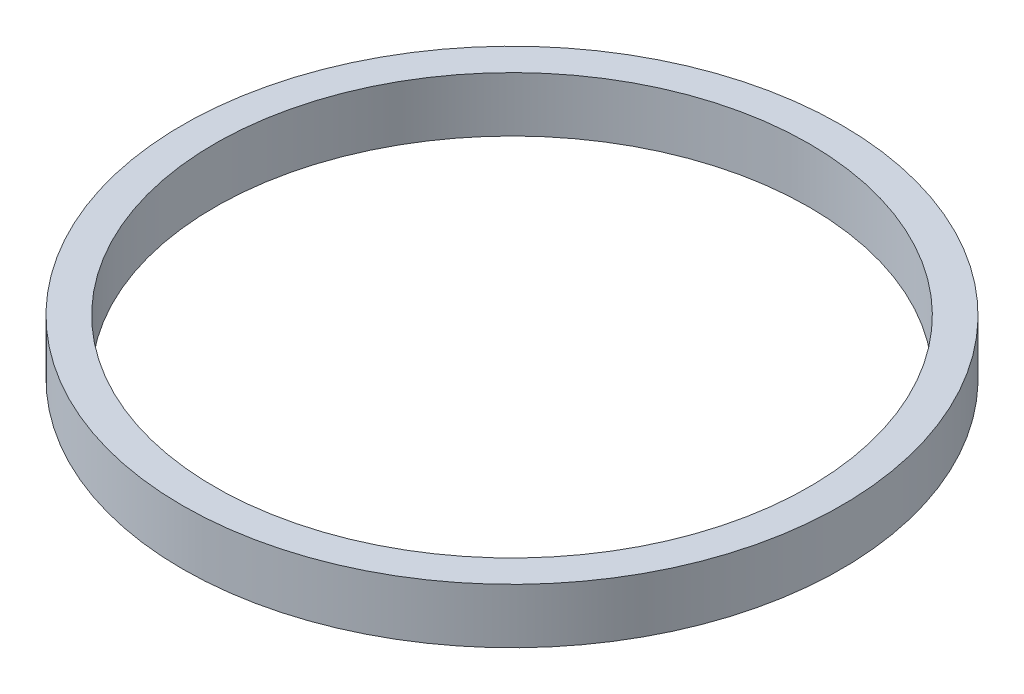
ISO-10303-21;
HEADER;
FILE_DESCRIPTION(('STEP AP214'),'2;1');
FILE_NAME('part.step','',(''),(''),'','','');
FILE_SCHEMA(('AUTOMOTIVE_DESIGN { 1 0 10303 214 1 1 1 1 }'));
ENDSEC;
DATA;
#1=APPLICATION_CONTEXT('core data for automotive mechanical design processes');
#2=APPLICATION_PROTOCOL_DEFINITION('international standard','automotive_design',2000,#1);
#3=PRODUCT_CONTEXT('',#1,'mechanical');
#4=PRODUCT('Part','Part','',(#3));
#5=PRODUCT_RELATED_PRODUCT_CATEGORY('part','',(#4));
#6=PRODUCT_DEFINITION_FORMATION('','',#4);
#7=PRODUCT_DEFINITION_CONTEXT('part definition',#1,'design');
#8=PRODUCT_DEFINITION('design','',#6,#7);
#9=PRODUCT_DEFINITION_SHAPE('','',#8);
#10=(LENGTH_UNIT() NAMED_UNIT(*) SI_UNIT(.MILLI.,.METRE.));
#11=(NAMED_UNIT(*) PLANE_ANGLE_UNIT() SI_UNIT($,.RADIAN.));
#12=(NAMED_UNIT(*) SI_UNIT($,.STERADIAN.) SOLID_ANGLE_UNIT());
#13=UNCERTAINTY_MEASURE_WITH_UNIT(LENGTH_MEASURE(1.E-05),#10,'distance_accuracy_value','');
#14=(GEOMETRIC_REPRESENTATION_CONTEXT(3) GLOBAL_UNCERTAINTY_ASSIGNED_CONTEXT((#13)) GLOBAL_UNIT_ASSIGNED_CONTEXT((#10,
#11,#12)) REPRESENTATION_CONTEXT('',''));
#15=CARTESIAN_POINT('',(0.,0.,0.));
#16=DIRECTION('',(0.,0.,1.));
#17=DIRECTION('',(1.,0.,0.));
#18=AXIS2_PLACEMENT_3D('',#15,#16,#17);
#19=CARTESIAN_POINT('',(0.,2.35,0.));
#20=DIRECTION('',(0.,-1.,0.));
#21=DIRECTION('',(0.,0.,-1.));
#22=AXIS2_PLACEMENT_3D('',#19,#20,#21);
#23=PLANE('',#22);
#24=CARTESIAN_POINT('',(0.,2.35,0.));
#25=DIRECTION('',(0.,1.,0.));
#26=DIRECTION('',(0.,0.,1.));
#27=AXIS2_PLACEMENT_3D('',#24,#25,#26);
#28=CIRCLE('',#27,4.6);
#29=CARTESIAN_POINT('',(0.,2.35,-4.6));
#30=VERTEX_POINT('',#29);
#31=EDGE_CURVE('E11',#30,#30,#28,.T.);
#32=ORIENTED_EDGE('',*,*,#31,.F.);
#33=EDGE_LOOP('',(#32));
#34=FACE_BOUND('',#33,.T.);
#35=CARTESIAN_POINT('',(0.,2.35,0.));
#36=DIRECTION('',(0.,-1.,0.));
#37=DIRECTION('',(0.,0.,-1.));
#38=AXIS2_PLACEMENT_3D('',#35,#36,#37);
#39=CIRCLE('',#38,5.1);
#40=CARTESIAN_POINT('',(0.,2.35,5.1));
#41=VERTEX_POINT('',#40);
#42=EDGE_CURVE('E54',#41,#41,#39,.T.);
#43=ORIENTED_EDGE('',*,*,#42,.F.);
#44=EDGE_LOOP('',(#43));
#45=FACE_BOUND('',#44,.T.);
#46=ADVANCED_FACE('F16',(#34,#45),#23,.F.);
#47=CARTESIAN_POINT('',(0.,1.5,0.));
#48=DIRECTION('',(0.,-1.,0.));
#49=DIRECTION('',(0.,0.,-1.));
#50=AXIS2_PLACEMENT_3D('',#47,#48,#49);
#51=PLANE('',#50);
#52=CARTESIAN_POINT('',(0.,1.5,0.));
#53=DIRECTION('',(0.,1.,0.));
#54=DIRECTION('',(0.,0.,1.));
#55=AXIS2_PLACEMENT_3D('',#52,#53,#54);
#56=CIRCLE('',#55,4.6);
#57=CARTESIAN_POINT('',(0.,1.5,-4.6));
#58=VERTEX_POINT('',#57);
#59=EDGE_CURVE('E59',#58,#58,#56,.T.);
#60=ORIENTED_EDGE('',*,*,#59,.T.);
#61=EDGE_LOOP('',(#60));
#62=FACE_BOUND('',#61,.T.);
#63=CARTESIAN_POINT('',(0.,1.5,0.));
#64=DIRECTION('',(0.,1.,0.));
#65=DIRECTION('',(0.,0.,-1.));
#66=AXIS2_PLACEMENT_3D('',#63,#64,#65);
#67=CIRCLE('',#66,5.1);
#68=CARTESIAN_POINT('',(0.,1.5,5.1));
#69=VERTEX_POINT('',#68);
#70=EDGE_CURVE('E52',#69,#69,#67,.T.);
#71=ORIENTED_EDGE('',*,*,#70,.F.);
#72=EDGE_LOOP('',(#71));
#73=FACE_BOUND('',#72,.T.);
#74=ADVANCED_FACE('F72',(#62,#73),#51,.T.);
#75=CARTESIAN_POINT('',(0.,1.5,0.));
#76=DIRECTION('',(0.,1.,0.));
#77=DIRECTION('',(0.,0.,1.));
#78=AXIS2_PLACEMENT_3D('',#75,#76,#77);
#79=CYLINDRICAL_SURFACE('',#78,4.6);
#80=ORIENTED_EDGE('',*,*,#59,.F.);
#81=DIRECTION('',(0.,1.,0.));
#82=VECTOR('',#81,1.);
#83=CARTESIAN_POINT('',(0.,1.5,-4.6));
#84=LINE('',#83,#82);
#85=EDGE_CURVE('E27',#58,#30,#84,.T.);
#86=ORIENTED_EDGE('',*,*,#85,.T.);
#87=ORIENTED_EDGE('',*,*,#31,.T.);
#88=ORIENTED_EDGE('',*,*,#85,.F.);
#89=EDGE_LOOP('',(#80,#86,#87,#88));
#90=FACE_BOUND('',#89,.T.);
#91=ADVANCED_FACE('F18',(#90),#79,.F.);
#92=CARTESIAN_POINT('',(0.,2.35,0.));
#93=DIRECTION('',(0.,-1.,0.));
#94=DIRECTION('',(0.,0.,-1.));
#95=AXIS2_PLACEMENT_3D('',#92,#93,#94);
#96=CYLINDRICAL_SURFACE('',#95,5.1);
#97=ORIENTED_EDGE('',*,*,#70,.T.);
#98=DIRECTION('',(0.,1.,0.));
#99=VECTOR('',#98,1.);
#100=CARTESIAN_POINT('',(0.,2.35,5.1));
#101=LINE('',#100,#99);
#102=EDGE_CURVE('E20',#69,#41,#101,.T.);
#103=ORIENTED_EDGE('',*,*,#102,.T.);
#104=ORIENTED_EDGE('',*,*,#42,.T.);
#105=ORIENTED_EDGE('',*,*,#102,.F.);
#106=EDGE_LOOP('',(#97,#103,#104,#105));
#107=FACE_BOUND('',#106,.T.);
#108=ADVANCED_FACE('F50',(#107),#96,.T.);
#109=CLOSED_SHELL('',(#46,#74,#91,#108));
#110=MANIFOLD_SOLID_BREP('B1',#109);
#111=ADVANCED_BREP_SHAPE_REPRESENTATION('',(#18,#110),#14);
#112=SHAPE_DEFINITION_REPRESENTATION(#9,#111);
ENDSEC;
END-ISO-10303-21;
